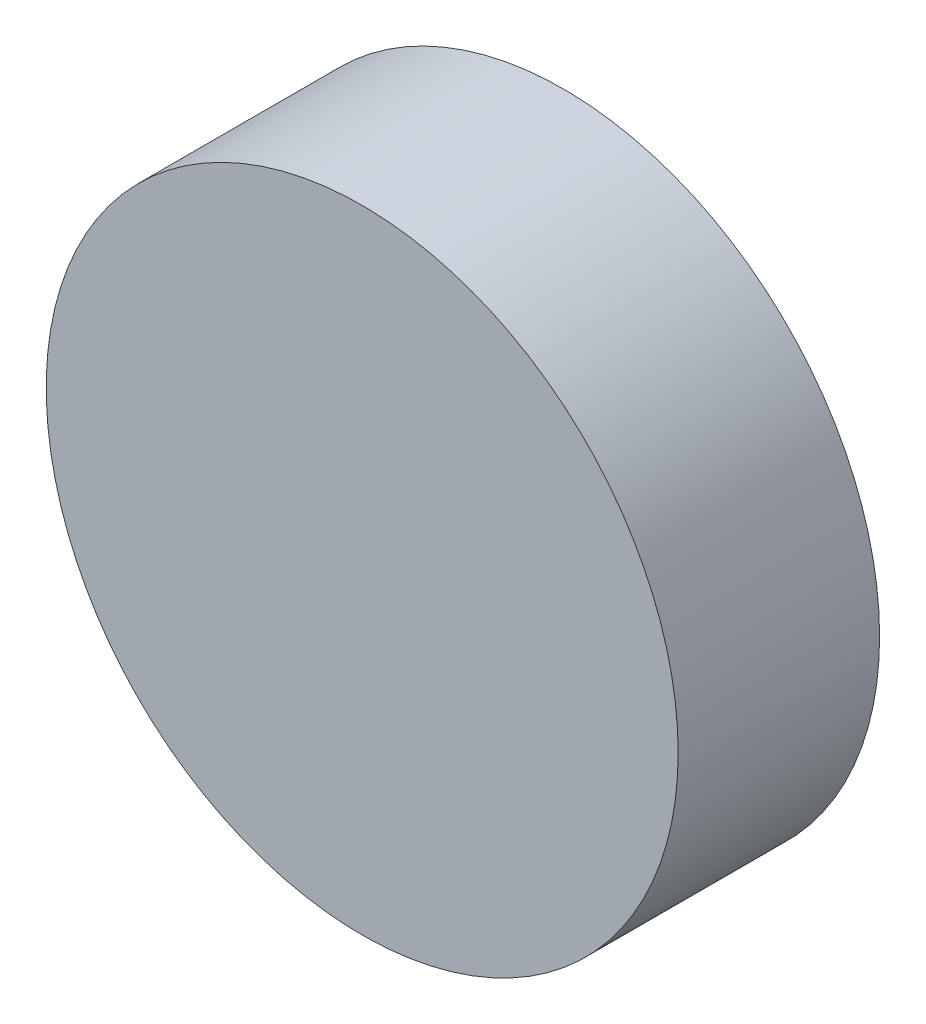
ISO-10303-21;
HEADER;
FILE_DESCRIPTION(('STEP AP214'),'2;1');
FILE_NAME('part.step','',(''),(''),'','','');
FILE_SCHEMA(('AUTOMOTIVE_DESIGN { 1 0 10303 214 1 1 1 1 }'));
ENDSEC;
DATA;
#1=APPLICATION_CONTEXT('core data for automotive mechanical design processes');
#2=APPLICATION_PROTOCOL_DEFINITION('international standard','automotive_design',2000,#1);
#3=PRODUCT_CONTEXT('',#1,'mechanical');
#4=PRODUCT('Part','Part','',(#3));
#5=PRODUCT_RELATED_PRODUCT_CATEGORY('part','',(#4));
#6=PRODUCT_DEFINITION_FORMATION('','',#4);
#7=PRODUCT_DEFINITION_CONTEXT('part definition',#1,'design');
#8=PRODUCT_DEFINITION('design','',#6,#7);
#9=PRODUCT_DEFINITION_SHAPE('','',#8);
#10=(LENGTH_UNIT() NAMED_UNIT(*) SI_UNIT(.MILLI.,.METRE.));
#11=(NAMED_UNIT(*) PLANE_ANGLE_UNIT() SI_UNIT($,.RADIAN.));
#12=(NAMED_UNIT(*) SI_UNIT($,.STERADIAN.) SOLID_ANGLE_UNIT());
#13=UNCERTAINTY_MEASURE_WITH_UNIT(LENGTH_MEASURE(1.E-05),#10,'distance_accuracy_value','');
#14=(GEOMETRIC_REPRESENTATION_CONTEXT(3) GLOBAL_UNCERTAINTY_ASSIGNED_CONTEXT((#13)) GLOBAL_UNIT_ASSIGNED_CONTEXT((#10,
#11,#12)) REPRESENTATION_CONTEXT('',''));
#15=CARTESIAN_POINT('',(0.,0.,0.));
#16=DIRECTION('',(0.,0.,1.));
#17=DIRECTION('',(1.,0.,0.));
#18=AXIS2_PLACEMENT_3D('',#15,#16,#17);
#19=CARTESIAN_POINT('',(0.,0.,25.5));
#20=DIRECTION('',(0.,0.,-1.));
#21=DIRECTION('',(-1.,0.,0.));
#22=AXIS2_PLACEMENT_3D('',#19,#20,#21);
#23=CYLINDRICAL_SURFACE('',#22,40.);
#24=CARTESIAN_POINT('',(0.,0.,25.5));
#25=DIRECTION('',(0.,0.,1.));
#26=DIRECTION('',(1.,0.,0.));
#27=AXIS2_PLACEMENT_3D('',#24,#25,#26);
#28=CIRCLE('',#27,40.);
#29=CARTESIAN_POINT('',(40.,0.,25.5));
#30=VERTEX_POINT('',#29);
#31=EDGE_CURVE('E10',#30,#30,#28,.T.);
#32=ORIENTED_EDGE('',*,*,#31,.F.);
#33=EDGE_LOOP('',(#32));
#34=FACE_BOUND('',#33,.T.);
#35=CARTESIAN_POINT('',(0.,0.,0.));
#36=DIRECTION('',(0.,0.,1.));
#37=DIRECTION('',(1.,0.,0.));
#38=AXIS2_PLACEMENT_3D('',#35,#36,#37);
#39=CIRCLE('',#38,40.);
#40=CARTESIAN_POINT('',(40.,0.,0.));
#41=VERTEX_POINT('',#40);
#42=EDGE_CURVE('E33',#41,#41,#39,.T.);
#43=ORIENTED_EDGE('',*,*,#42,.T.);
#44=EDGE_LOOP('',(#43));
#45=FACE_BOUND('',#44,.T.);
#46=ADVANCED_FACE('F30',(#34,#45),#23,.T.);
#47=CARTESIAN_POINT('',(0.,0.,25.5));
#48=DIRECTION('',(0.,0.,1.));
#49=DIRECTION('',(1.,0.,0.));
#50=AXIS2_PLACEMENT_3D('',#47,#48,#49);
#51=PLANE('',#50);
#52=ORIENTED_EDGE('',*,*,#31,.T.);
#53=EDGE_LOOP('',(#52));
#54=FACE_BOUND('',#53,.T.);
#55=ADVANCED_FACE('F79',(#54),#51,.T.);
#56=CARTESIAN_POINT('',(0.,0.,0.));
#57=DIRECTION('',(0.,0.,1.));
#58=DIRECTION('',(1.,0.,0.));
#59=AXIS2_PLACEMENT_3D('',#56,#57,#58);
#60=PLANE('',#59);
#61=CARTESIAN_POINT('',(0.,33.65,0.));
#62=DIRECTION('',(0.,0.,-1.));
#63=DIRECTION('',(-1.,0.,0.));
#64=AXIS2_PLACEMENT_3D('',#61,#62,#63);
#65=CIRCLE('',#64,3.45);
#66=CARTESIAN_POINT('',(-3.45,33.65,0.));
#67=VERTEX_POINT('',#66);
#68=EDGE_CURVE('E60',#67,#67,#65,.T.);
#69=ORIENTED_EDGE('',*,*,#68,.F.);
#70=EDGE_LOOP('',(#69));
#71=FACE_BOUND('',#70,.T.);
#72=CARTESIAN_POINT('',(-33.65,0.,0.));
#73=DIRECTION('',(0.,0.,-1.));
#74=DIRECTION('',(-1.,0.,0.));
#75=AXIS2_PLACEMENT_3D('',#72,#73,#74);
#76=CIRCLE('',#75,3.45);
#77=CARTESIAN_POINT('',(-37.1,0.,0.));
#78=VERTEX_POINT('',#77);
#79=EDGE_CURVE('E54',#78,#78,#76,.T.);
#80=ORIENTED_EDGE('',*,*,#79,.F.);
#81=EDGE_LOOP('',(#80));
#82=FACE_BOUND('',#81,.T.);
#83=CARTESIAN_POINT('',(0.,-33.65,0.));
#84=DIRECTION('',(0.,0.,-1.));
#85=DIRECTION('',(1.,0.,0.));
#86=AXIS2_PLACEMENT_3D('',#83,#84,#85);
#87=CIRCLE('',#86,3.45);
#88=CARTESIAN_POINT('',(3.45,-33.65,0.));
#89=VERTEX_POINT('',#88);
#90=EDGE_CURVE('E48',#89,#89,#87,.T.);
#91=ORIENTED_EDGE('',*,*,#90,.F.);
#92=EDGE_LOOP('',(#91));
#93=FACE_BOUND('',#92,.T.);
#94=CARTESIAN_POINT('',(33.65,0.,0.));
#95=DIRECTION('',(0.,0.,-1.));
#96=DIRECTION('',(1.,0.,0.));
#97=AXIS2_PLACEMENT_3D('',#94,#95,#96);
#98=CIRCLE('',#97,3.45);
#99=CARTESIAN_POINT('',(37.1,0.,0.));
#100=VERTEX_POINT('',#99);
#101=EDGE_CURVE('E42',#100,#100,#98,.T.);
#102=ORIENTED_EDGE('',*,*,#101,.F.);
#103=EDGE_LOOP('',(#102));
#104=FACE_BOUND('',#103,.T.);
#105=ORIENTED_EDGE('',*,*,#42,.F.);
#106=EDGE_LOOP('',(#105));
#107=FACE_BOUND('',#106,.T.);
#108=ADVANCED_FACE('F75',(#71,#82,#93,#104,#107),#60,.F.);
#109=CARTESIAN_POINT('',(33.65,0.,5.));
#110=DIRECTION('',(0.,0.,-1.));
#111=DIRECTION('',(-1.,0.,0.));
#112=AXIS2_PLACEMENT_3D('',#109,#110,#111);
#113=CYLINDRICAL_SURFACE('',#112,3.45);
#114=CARTESIAN_POINT('',(33.65,0.,5.));
#115=DIRECTION('',(0.,0.,-1.));
#116=DIRECTION('',(1.,0.,0.));
#117=AXIS2_PLACEMENT_3D('',#114,#115,#116);
#118=CIRCLE('',#117,3.45);
#119=CARTESIAN_POINT('',(37.1,0.,5.));
#120=VERTEX_POINT('',#119);
#121=EDGE_CURVE('E45',#120,#120,#118,.T.);
#122=ORIENTED_EDGE('',*,*,#121,.F.);
#123=EDGE_LOOP('',(#122));
#124=FACE_BOUND('',#123,.T.);
#125=ORIENTED_EDGE('',*,*,#101,.T.);
#126=EDGE_LOOP('',(#125));
#127=FACE_BOUND('',#126,.T.);
#128=ADVANCED_FACE('F78',(#124,#127),#113,.F.);
#129=CARTESIAN_POINT('',(33.65,0.,5.));
#130=DIRECTION('',(0.,0.,1.));
#131=DIRECTION('',(1.,0.,0.));
#132=AXIS2_PLACEMENT_3D('',#129,#130,#131);
#133=PLANE('',#132);
#134=ORIENTED_EDGE('',*,*,#121,.T.);
#135=EDGE_LOOP('',(#134));
#136=FACE_BOUND('',#135,.T.);
#137=ADVANCED_FACE('F99',(#136),#133,.F.);
#138=CARTESIAN_POINT('',(0.,-33.65,5.));
#139=DIRECTION('',(0.,0.,-1.));
#140=DIRECTION('',(-1.,0.,0.));
#141=AXIS2_PLACEMENT_3D('',#138,#139,#140);
#142=CYLINDRICAL_SURFACE('',#141,3.45);
#143=CARTESIAN_POINT('',(0.,-33.65,5.));
#144=DIRECTION('',(0.,0.,-1.));
#145=DIRECTION('',(1.,0.,0.));
#146=AXIS2_PLACEMENT_3D('',#143,#144,#145);
#147=CIRCLE('',#146,3.45);
#148=CARTESIAN_POINT('',(3.45,-33.65,5.));
#149=VERTEX_POINT('',#148);
#150=EDGE_CURVE('E51',#149,#149,#147,.T.);
#151=ORIENTED_EDGE('',*,*,#150,.F.);
#152=EDGE_LOOP('',(#151));
#153=FACE_BOUND('',#152,.T.);
#154=ORIENTED_EDGE('',*,*,#90,.T.);
#155=EDGE_LOOP('',(#154));
#156=FACE_BOUND('',#155,.T.);
#157=ADVANCED_FACE('F103',(#153,#156),#142,.F.);
#158=CARTESIAN_POINT('',(0.,-33.65,5.));
#159=DIRECTION('',(0.,0.,1.));
#160=DIRECTION('',(1.,0.,0.));
#161=AXIS2_PLACEMENT_3D('',#158,#159,#160);
#162=PLANE('',#161);
#163=ORIENTED_EDGE('',*,*,#150,.T.);
#164=EDGE_LOOP('',(#163));
#165=FACE_BOUND('',#164,.T.);
#166=ADVANCED_FACE('F107',(#165),#162,.F.);
#167=CARTESIAN_POINT('',(-33.65,0.,5.));
#168=DIRECTION('',(0.,0.,-1.));
#169=DIRECTION('',(-1.,0.,0.));
#170=AXIS2_PLACEMENT_3D('',#167,#168,#169);
#171=CYLINDRICAL_SURFACE('',#170,3.45);
#172=CARTESIAN_POINT('',(-33.65,0.,5.));
#173=DIRECTION('',(0.,0.,-1.));
#174=DIRECTION('',(-1.,0.,0.));
#175=AXIS2_PLACEMENT_3D('',#172,#173,#174);
#176=CIRCLE('',#175,3.45);
#177=CARTESIAN_POINT('',(-37.1,0.,5.));
#178=VERTEX_POINT('',#177);
#179=EDGE_CURVE('E57',#178,#178,#176,.T.);
#180=ORIENTED_EDGE('',*,*,#179,.F.);
#181=EDGE_LOOP('',(#180));
#182=FACE_BOUND('',#181,.T.);
#183=ORIENTED_EDGE('',*,*,#79,.T.);
#184=EDGE_LOOP('',(#183));
#185=FACE_BOUND('',#184,.T.);
#186=ADVANCED_FACE('F111',(#182,#185),#171,.F.);
#187=CARTESIAN_POINT('',(-33.65,0.,5.));
#188=DIRECTION('',(0.,0.,-1.));
#189=DIRECTION('',(-1.,0.,0.));
#190=AXIS2_PLACEMENT_3D('',#187,#188,#189);
#191=PLANE('',#190);
#192=ORIENTED_EDGE('',*,*,#179,.T.);
#193=EDGE_LOOP('',(#192));
#194=FACE_BOUND('',#193,.T.);
#195=ADVANCED_FACE('F71',(#194),#191,.T.);
#196=CARTESIAN_POINT('',(0.,33.65,5.));
#197=DIRECTION('',(0.,0.,-1.));
#198=DIRECTION('',(-1.,0.,0.));
#199=AXIS2_PLACEMENT_3D('',#196,#197,#198);
#200=CYLINDRICAL_SURFACE('',#199,3.45);
#201=CARTESIAN_POINT('',(0.,33.65,5.));
#202=DIRECTION('',(0.,0.,-1.));
#203=DIRECTION('',(-1.,0.,0.));
#204=AXIS2_PLACEMENT_3D('',#201,#202,#203);
#205=CIRCLE('',#204,3.45);
#206=CARTESIAN_POINT('',(-3.45,33.65,5.));
#207=VERTEX_POINT('',#206);
#208=EDGE_CURVE('E40',#207,#207,#205,.T.);
#209=ORIENTED_EDGE('',*,*,#208,.F.);
#210=EDGE_LOOP('',(#209));
#211=FACE_BOUND('',#210,.T.);
#212=ORIENTED_EDGE('',*,*,#68,.T.);
#213=EDGE_LOOP('',(#212));
#214=FACE_BOUND('',#213,.T.);
#215=ADVANCED_FACE('F68',(#211,#214),#200,.F.);
#216=CARTESIAN_POINT('',(0.,33.65,5.));
#217=DIRECTION('',(0.,0.,-1.));
#218=DIRECTION('',(-1.,0.,0.));
#219=AXIS2_PLACEMENT_3D('',#216,#217,#218);
#220=PLANE('',#219);
#221=ORIENTED_EDGE('',*,*,#208,.T.);
#222=EDGE_LOOP('',(#221));
#223=FACE_BOUND('',#222,.T.);
#224=ADVANCED_FACE('F66',(#223),#220,.T.);
#225=CLOSED_SHELL('',(#46,#55,#108,#128,#137,#157,#166,#186,#195,#215,#224));
#226=MANIFOLD_SOLID_BREP('B2',#225);
#227=ADVANCED_BREP_SHAPE_REPRESENTATION('',(#18,#226),#14);
#228=SHAPE_DEFINITION_REPRESENTATION(#9,#227);
ENDSEC;
END-ISO-10303-21;
